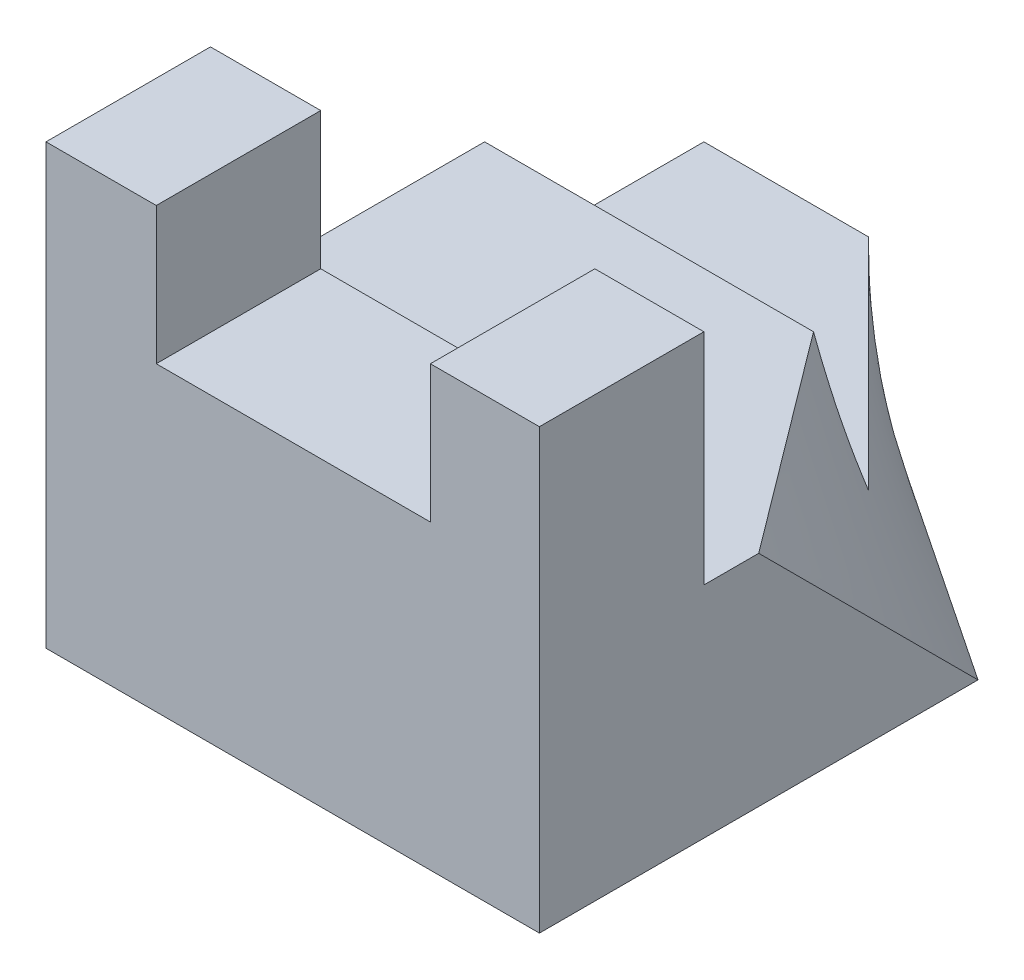
ISO-10303-21;
HEADER;
FILE_DESCRIPTION(('STEP AP214'),'2;1');
FILE_NAME('part.step','',(''),(''),'','','');
FILE_SCHEMA(('AUTOMOTIVE_DESIGN { 1 0 10303 214 1 1 1 1 }'));
ENDSEC;
DATA;
#1=APPLICATION_CONTEXT('core data for automotive mechanical design processes');
#2=APPLICATION_PROTOCOL_DEFINITION('international standard','automotive_design',2000,#1);
#3=PRODUCT_CONTEXT('',#1,'mechanical');
#4=PRODUCT('Part','Part','',(#3));
#5=PRODUCT_RELATED_PRODUCT_CATEGORY('part','',(#4));
#6=PRODUCT_DEFINITION_FORMATION('','',#4);
#7=PRODUCT_DEFINITION_CONTEXT('part definition',#1,'design');
#8=PRODUCT_DEFINITION('design','',#6,#7);
#9=PRODUCT_DEFINITION_SHAPE('','',#8);
#10=(LENGTH_UNIT() NAMED_UNIT(*) SI_UNIT(.MILLI.,.METRE.));
#11=(NAMED_UNIT(*) PLANE_ANGLE_UNIT() SI_UNIT($,.RADIAN.));
#12=(NAMED_UNIT(*) SI_UNIT($,.STERADIAN.) SOLID_ANGLE_UNIT());
#13=UNCERTAINTY_MEASURE_WITH_UNIT(LENGTH_MEASURE(1.E-05),#10,'distance_accuracy_value','');
#14=(GEOMETRIC_REPRESENTATION_CONTEXT(3) GLOBAL_UNCERTAINTY_ASSIGNED_CONTEXT((#13)) GLOBAL_UNIT_ASSIGNED_CONTEXT((#10,
#11,#12)) REPRESENTATION_CONTEXT('',''));
#15=CARTESIAN_POINT('',(0.,0.,0.));
#16=DIRECTION('',(0.,0.,1.));
#17=DIRECTION('',(1.,0.,0.));
#18=AXIS2_PLACEMENT_3D('',#15,#16,#17);
#19=CARTESIAN_POINT('',(-57.15,50.8,19.05));
#20=DIRECTION('',(0.,1.,0.));
#21=DIRECTION('',(0.,0.,1.));
#22=AXIS2_PLACEMENT_3D('',#19,#20,#21);
#23=PLANE('',#22);
#24=DIRECTION('',(0.,0.,-1.));
#25=VECTOR('',#24,1.);
#26=CARTESIAN_POINT('',(-12.6287691119639,50.8,76.2));
#27=LINE('',#26,#25);
#28=CARTESIAN_POINT('',(-12.6287691119639,50.8,38.1));
#29=VERTEX_POINT('',#28);
#30=CARTESIAN_POINT('',(-12.6287691119639,50.8,19.05));
#31=VERTEX_POINT('',#30);
#32=EDGE_CURVE('E279',#29,#31,#27,.T.);
#33=ORIENTED_EDGE('',*,*,#32,.F.);
#34=DIRECTION('',(1.,0.,0.));
#35=VECTOR('',#34,1.);
#36=CARTESIAN_POINT('',(-57.15,50.8,38.1));
#37=LINE('',#36,#35);
#38=CARTESIAN_POINT('',(0.,50.8,38.1));
#39=VERTEX_POINT('',#38);
#40=EDGE_CURVE('E236',#29,#39,#37,.T.);
#41=ORIENTED_EDGE('',*,*,#40,.T.);
#42=DIRECTION('',(0.,0.,1.));
#43=VECTOR('',#42,1.);
#44=CARTESIAN_POINT('',(0.,50.8,19.05));
#45=LINE('',#44,#43);
#46=CARTESIAN_POINT('',(0.,50.8,19.05));
#47=VERTEX_POINT('',#46);
#48=EDGE_CURVE('E230',#47,#39,#45,.T.);
#49=ORIENTED_EDGE('',*,*,#48,.F.);
#50=DIRECTION('',(1.,0.,0.));
#51=VECTOR('',#50,1.);
#52=CARTESIAN_POINT('',(-57.15,50.8,19.05));
#53=LINE('',#52,#51);
#54=EDGE_CURVE('E224',#31,#47,#53,.T.);
#55=ORIENTED_EDGE('',*,*,#54,.F.);
#56=EDGE_LOOP('',(#33,#41,#49,#55));
#57=FACE_BOUND('',#56,.T.);
#58=ADVANCED_FACE('F39',(#57),#23,.T.);
#59=CARTESIAN_POINT('',(-57.15,0.,-38.1));
#60=DIRECTION('',(0.,0.,-1.));
#61=DIRECTION('',(-1.,0.,0.));
#62=AXIS2_PLACEMENT_3D('',#59,#60,#61);
#63=PLANE('',#62);
#64=DIRECTION('',(0.,-1.,0.));
#65=VECTOR('',#64,1.);
#66=CARTESIAN_POINT('',(-38.1,12.7,-38.1));
#67=LINE('',#66,#65);
#68=CARTESIAN_POINT('',(-38.1,12.7,-38.1));
#69=VERTEX_POINT('',#68);
#70=CARTESIAN_POINT('',(-38.1,0.,-38.1));
#71=VERTEX_POINT('',#70);
#72=EDGE_CURVE('E139',#69,#71,#67,.T.);
#73=ORIENTED_EDGE('',*,*,#72,.T.);
#74=DIRECTION('',(1.,0.,0.));
#75=VECTOR('',#74,1.);
#76=CARTESIAN_POINT('',(-57.15,0.,-38.1));
#77=LINE('',#76,#75);
#78=CARTESIAN_POINT('',(-57.15,0.,-38.1));
#79=VERTEX_POINT('',#78);
#80=EDGE_CURVE('E12',#79,#71,#77,.T.);
#81=ORIENTED_EDGE('',*,*,#80,.F.);
#82=DIRECTION('',(0.,1.,0.));
#83=VECTOR('',#82,1.);
#84=CARTESIAN_POINT('',(-57.15,0.,-38.1));
#85=LINE('',#84,#83);
#86=CARTESIAN_POINT('',(-57.15,12.7,-38.1));
#87=VERTEX_POINT('',#86);
#88=EDGE_CURVE('E179',#79,#87,#85,.T.);
#89=ORIENTED_EDGE('',*,*,#88,.T.);
#90=DIRECTION('',(1.,0.,0.));
#91=VECTOR('',#90,1.);
#92=CARTESIAN_POINT('',(-57.15,12.7,-38.1));
#93=LINE('',#92,#91);
#94=EDGE_CURVE('E150',#87,#69,#93,.T.);
#95=ORIENTED_EDGE('',*,*,#94,.T.);
#96=EDGE_LOOP('',(#73,#81,#89,#95));
#97=FACE_BOUND('',#96,.T.);
#98=ADVANCED_FACE('F41',(#97),#63,.T.);
#99=CARTESIAN_POINT('',(-57.15,0.,38.1));
#100=DIRECTION('',(0.,-1.,0.));
#101=DIRECTION('',(0.,0.,-1.));
#102=AXIS2_PLACEMENT_3D('',#99,#100,#101);
#103=PLANE('',#102);
#104=DIRECTION('',(0.832050294337844,0.,0.554700196225229));
#105=VECTOR('',#104,1.);
#106=CARTESIAN_POINT('',(-38.1,0.,-38.1));
#107=LINE('',#106,#105);
#108=CARTESIAN_POINT('',(0.,0.,-12.7));
#109=VERTEX_POINT('',#108);
#110=EDGE_CURVE('E136',#71,#109,#107,.T.);
#111=ORIENTED_EDGE('',*,*,#110,.T.);
#112=DIRECTION('',(0.,0.,-1.));
#113=VECTOR('',#112,1.);
#114=CARTESIAN_POINT('',(0.,0.,38.1));
#115=LINE('',#114,#113);
#116=CARTESIAN_POINT('',(0.,0.,38.1));
#117=VERTEX_POINT('',#116);
#118=EDGE_CURVE('E176',#117,#109,#115,.T.);
#119=ORIENTED_EDGE('',*,*,#118,.F.);
#120=DIRECTION('',(1.,0.,0.));
#121=VECTOR('',#120,1.);
#122=CARTESIAN_POINT('',(-57.15,0.,38.1));
#123=LINE('',#122,#121);
#124=CARTESIAN_POINT('',(-57.15,0.,38.1));
#125=VERTEX_POINT('',#124);
#126=EDGE_CURVE('E48',#125,#117,#123,.T.);
#127=ORIENTED_EDGE('',*,*,#126,.F.);
#128=DIRECTION('',(0.,0.,-1.));
#129=VECTOR('',#128,1.);
#130=CARTESIAN_POINT('',(-57.15,0.,38.1));
#131=LINE('',#130,#129);
#132=EDGE_CURVE('E155',#125,#79,#131,.T.);
#133=ORIENTED_EDGE('',*,*,#132,.T.);
#134=ORIENTED_EDGE('',*,*,#80,.T.);
#135=EDGE_LOOP('',(#111,#119,#127,#133,#134));
#136=FACE_BOUND('',#135,.T.);
#137=ADVANCED_FACE('F153',(#136),#103,.T.);
#138=CARTESIAN_POINT('',(-57.15,50.8,38.1));
#139=DIRECTION('',(0.,0.,1.));
#140=DIRECTION('',(1.,0.,0.));
#141=AXIS2_PLACEMENT_3D('',#138,#139,#140);
#142=PLANE('',#141);
#143=DIRECTION('',(0.,1.,0.));
#144=VECTOR('',#143,1.);
#145=CARTESIAN_POINT('',(-12.6287691119639,50.8,38.1));
#146=LINE('',#145,#144);
#147=CARTESIAN_POINT('',(-12.6287691119639,34.925,38.1));
#148=VERTEX_POINT('',#147);
#149=EDGE_CURVE('E174',#148,#29,#146,.T.);
#150=ORIENTED_EDGE('',*,*,#149,.F.);
#151=DIRECTION('',(1.,0.,0.));
#152=VECTOR('',#151,1.);
#153=CARTESIAN_POINT('',(-57.15,34.925,38.1));
#154=LINE('',#153,#152);
#155=CARTESIAN_POINT('',(-44.3787691119639,34.925,38.1));
#156=VERTEX_POINT('',#155);
#157=EDGE_CURVE('E281',#156,#148,#154,.T.);
#158=ORIENTED_EDGE('',*,*,#157,.F.);
#159=DIRECTION('',(0.,-1.,0.));
#160=VECTOR('',#159,1.);
#161=CARTESIAN_POINT('',(-44.3787691119639,50.8,38.1));
#162=LINE('',#161,#160);
#163=CARTESIAN_POINT('',(-44.3787691119639,50.8,38.1));
#164=VERTEX_POINT('',#163);
#165=EDGE_CURVE('E286',#164,#156,#162,.T.);
#166=ORIENTED_EDGE('',*,*,#165,.F.);
#167=CARTESIAN_POINT('',(-57.15,50.8,38.1));
#168=VERTEX_POINT('',#167);
#169=EDGE_CURVE('E237',#168,#164,#37,.T.);
#170=ORIENTED_EDGE('',*,*,#169,.F.);
#171=DIRECTION('',(0.,-1.,0.));
#172=VECTOR('',#171,1.);
#173=CARTESIAN_POINT('',(-57.15,50.8,38.1));
#174=LINE('',#173,#172);
#175=EDGE_CURVE('E159',#168,#125,#174,.T.);
#176=ORIENTED_EDGE('',*,*,#175,.T.);
#177=ORIENTED_EDGE('',*,*,#126,.T.);
#178=DIRECTION('',(0.,-1.,0.));
#179=VECTOR('',#178,1.);
#180=CARTESIAN_POINT('',(0.,50.8,38.1));
#181=LINE('',#180,#179);
#182=EDGE_CURVE('E180',#39,#117,#181,.T.);
#183=ORIENTED_EDGE('',*,*,#182,.F.);
#184=ORIENTED_EDGE('',*,*,#40,.F.);
#185=EDGE_LOOP('',(#150,#158,#166,#170,#176,#177,#183,#184));
#186=FACE_BOUND('',#185,.T.);
#187=ADVANCED_FACE('F235',(#186),#142,.T.);
#188=DIRECTION('',(0.,0.,-1.));
#189=VECTOR('',#188,1.);
#190=CARTESIAN_POINT('',(-44.3787691119639,50.8,76.2));
#191=LINE('',#190,#189);
#192=CARTESIAN_POINT('',(-44.3787691119639,50.8,19.05));
#193=VERTEX_POINT('',#192);
#194=EDGE_CURVE('E282',#164,#193,#191,.T.);
#195=ORIENTED_EDGE('',*,*,#194,.T.);
#196=CARTESIAN_POINT('',(-57.15,50.8,19.05));
#197=VERTEX_POINT('',#196);
#198=EDGE_CURVE('E242',#197,#193,#53,.T.);
#199=ORIENTED_EDGE('',*,*,#198,.F.);
#200=DIRECTION('',(0.,0.,1.));
#201=VECTOR('',#200,1.);
#202=CARTESIAN_POINT('',(-57.15,50.8,19.05));
#203=LINE('',#202,#201);
#204=EDGE_CURVE('E163',#197,#168,#203,.T.);
#205=ORIENTED_EDGE('',*,*,#204,.T.);
#206=ORIENTED_EDGE('',*,*,#169,.T.);
#207=EDGE_LOOP('',(#195,#199,#205,#206));
#208=FACE_BOUND('',#207,.T.);
#209=ADVANCED_FACE('F265',(#208),#23,.T.);
#210=CARTESIAN_POINT('',(-57.15,25.4,19.05));
#211=DIRECTION('',(0.,0.,-1.));
#212=DIRECTION('',(0.,1.,0.));
#213=AXIS2_PLACEMENT_3D('',#210,#211,#212);
#214=PLANE('',#213);
#215=DIRECTION('',(0.,-1.,0.));
#216=VECTOR('',#215,1.);
#217=CARTESIAN_POINT('',(-12.6287691119639,50.8,19.05));
#218=LINE('',#217,#216);
#219=CARTESIAN_POINT('',(-12.6287691119639,34.925,19.05));
#220=VERTEX_POINT('',#219);
#221=EDGE_CURVE('E65',#31,#220,#218,.T.);
#222=ORIENTED_EDGE('',*,*,#221,.F.);
#223=ORIENTED_EDGE('',*,*,#54,.T.);
#224=DIRECTION('',(0.,1.,0.));
#225=VECTOR('',#224,1.);
#226=CARTESIAN_POINT('',(0.,25.4,19.05));
#227=LINE('',#226,#225);
#228=CARTESIAN_POINT('',(0.,25.4,19.05));
#229=VERTEX_POINT('',#228);
#230=EDGE_CURVE('E169',#229,#47,#227,.T.);
#231=ORIENTED_EDGE('',*,*,#230,.F.);
#232=DIRECTION('',(1.,0.,0.));
#233=VECTOR('',#232,1.);
#234=CARTESIAN_POINT('',(-57.15,25.4,19.05));
#235=LINE('',#234,#233);
#236=CARTESIAN_POINT('',(-57.15,25.4,19.05));
#237=VERTEX_POINT('',#236);
#238=EDGE_CURVE('E217',#237,#229,#235,.T.);
#239=ORIENTED_EDGE('',*,*,#238,.F.);
#240=DIRECTION('',(0.,1.,0.));
#241=VECTOR('',#240,1.);
#242=CARTESIAN_POINT('',(-57.15,25.4,19.05));
#243=LINE('',#242,#241);
#244=EDGE_CURVE('E259',#237,#197,#243,.T.);
#245=ORIENTED_EDGE('',*,*,#244,.T.);
#246=ORIENTED_EDGE('',*,*,#198,.T.);
#247=DIRECTION('',(0.,1.,0.));
#248=VECTOR('',#247,1.);
#249=CARTESIAN_POINT('',(-44.3787691119639,34.925,19.05));
#250=LINE('',#249,#248);
#251=CARTESIAN_POINT('',(-44.3787691119639,34.925,19.05));
#252=VERTEX_POINT('',#251);
#253=EDGE_CURVE('E268',#252,#193,#250,.T.);
#254=ORIENTED_EDGE('',*,*,#253,.F.);
#255=DIRECTION('',(-1.,0.,0.));
#256=VECTOR('',#255,1.);
#257=CARTESIAN_POINT('',(-12.6287691119639,34.925,19.05));
#258=LINE('',#257,#256);
#259=EDGE_CURVE('E270',#220,#252,#258,.T.);
#260=ORIENTED_EDGE('',*,*,#259,.F.);
#261=EDGE_LOOP('',(#222,#223,#231,#239,#245,#246,#254,#260));
#262=FACE_BOUND('',#261,.T.);
#263=ADVANCED_FACE('F226',(#262),#214,.T.);
#264=CARTESIAN_POINT('',(-57.15,25.4,-12.7));
#265=DIRECTION('',(0.,1.,0.));
#266=DIRECTION('',(0.,0.,1.));
#267=AXIS2_PLACEMENT_3D('',#264,#265,#266);
#268=PLANE('',#267);
#269=DIRECTION('',(0.6,0.,0.8));
#270=VECTOR('',#269,1.);
#271=CARTESIAN_POINT('',(-38.1,25.4,-38.1));
#272=LINE('',#271,#270);
#273=CARTESIAN_POINT('',(-19.05,25.4,-12.7));
#274=VERTEX_POINT('',#273);
#275=CARTESIAN_POINT('',(0.,25.4,12.7));
#276=VERTEX_POINT('',#275);
#277=EDGE_CURVE('E56',#274,#276,#272,.T.);
#278=ORIENTED_EDGE('',*,*,#277,.F.);
#279=DIRECTION('',(1.,0.,0.));
#280=VECTOR('',#279,1.);
#281=CARTESIAN_POINT('',(-57.15,25.4,-12.7));
#282=LINE('',#281,#280);
#283=CARTESIAN_POINT('',(-57.15,25.4,-12.7));
#284=VERTEX_POINT('',#283);
#285=EDGE_CURVE('E181',#284,#274,#282,.T.);
#286=ORIENTED_EDGE('',*,*,#285,.F.);
#287=DIRECTION('',(0.,0.,1.));
#288=VECTOR('',#287,1.);
#289=CARTESIAN_POINT('',(-57.15,25.4,-12.7));
#290=LINE('',#289,#288);
#291=EDGE_CURVE('E220',#284,#237,#290,.T.);
#292=ORIENTED_EDGE('',*,*,#291,.T.);
#293=ORIENTED_EDGE('',*,*,#238,.T.);
#294=DIRECTION('',(0.,0.,1.));
#295=VECTOR('',#294,1.);
#296=CARTESIAN_POINT('',(0.,25.4,-12.7));
#297=LINE('',#296,#295);
#298=EDGE_CURVE('E172',#276,#229,#297,.T.);
#299=ORIENTED_EDGE('',*,*,#298,.F.);
#300=EDGE_LOOP('',(#278,#286,#292,#293,#299));
#301=FACE_BOUND('',#300,.T.);
#302=ADVANCED_FACE('F214',(#301),#268,.T.);
#303=CARTESIAN_POINT('',(-57.15,12.7,-12.7));
#304=DIRECTION('',(0.,0.,-1.));
#305=DIRECTION('',(-1.,0.,0.));
#306=AXIS2_PLACEMENT_3D('',#303,#304,#305);
#307=PLANE('',#306);
#308=CARTESIAN_POINT('',(-12.7,12.7,-12.7));
#309=CARTESIAN_POINT('',(-12.9200869699071,13.0301236124747,-12.7));
#310=CARTESIAN_POINT('',(-13.1362026475352,13.3628852299406,-12.7));
#311=CARTESIAN_POINT('',(-13.5601963578838,14.0326383626928,-12.7));
#312=CARTESIAN_POINT('',(-13.7680907411623,14.3696195242032,-12.7));
#313=CARTESIAN_POINT('',(-14.1759527088238,15.0476277676619,-12.7));
#314=CARTESIAN_POINT('',(-14.3759321193666,15.3886477414989,-12.7));
#315=CARTESIAN_POINT('',(-14.7682776556763,16.0745547552151,-12.7));
#316=CARTESIAN_POINT('',(-14.9606516685908,16.4194372861551,-12.7));
#317=CARTESIAN_POINT('',(-15.3380914861579,17.1128940272788,-12.7));
#318=CARTESIAN_POINT('',(-15.5231618213945,17.4614657732054,-12.7));
#319=CARTESIAN_POINT('',(-15.8862926918504,18.1621300533107,-12.7));
#320=CARTESIAN_POINT('',(-16.0643549460186,18.5142216972189,-12.7));
#321=CARTESIAN_POINT('',(-16.4136644009144,19.2215660730518,-12.7));
#322=CARTESIAN_POINT('',(-16.584914693609,19.5768172791393,-12.7));
#323=CARTESIAN_POINT('',(-16.9210016073417,20.2905460790275,-12.7));
#324=CARTESIAN_POINT('',(-17.0858351226643,20.6490251342465,-12.7));
#325=CARTESIAN_POINT('',(-17.40937358414,21.3690871240231,-12.7));
#326=CARTESIAN_POINT('',(-17.5680734300272,21.7306723485543,-12.7));
#327=CARTESIAN_POINT('',(-17.8796178914043,22.456829598029,-12.7));
#328=CARTESIAN_POINT('',(-18.0324558195722,22.8214044901662,-12.7));
#329=CARTESIAN_POINT('',(-18.332538498671,23.5534278872609,-12.7));
#330=CARTESIAN_POINT('',(-18.4797753307482,23.920879635226,-12.7));
#331=CARTESIAN_POINT('',(-18.7689053934225,24.6585527411544,-12.7));
#332=CARTESIAN_POINT('',(-18.9107897777669,25.0287775676925,-12.7));
#333=CARTESIAN_POINT('',(-19.05,25.4,-12.7));
#334=B_SPLINE_CURVE_WITH_KNOTS('',3,(#308,#309,#310,#311,#312,#313,#314,#315,#316,#317,#318,
#319,#320,#321,#322,#323,#324,#325,#326,#327,#328,#329,#330,#331,#332,#333),.UNSPECIFIED.,.F.,
.F.,(4,2,2,2,2,2,2,2,2,2,2,2,4),(0.,1.19024491084424,2.37798956467277,3.56388683812622,
4.7485201705035,5.93240672013124,7.11600105184382,8.29905186962863,9.48266833902054,
10.6672487149168,11.8531425403691,13.040654991591,14.2300510300286),.UNSPECIFIED.);
#335=CARTESIAN_POINT('',(-12.7,12.7,-12.7));
#336=VERTEX_POINT('',#335);
#337=EDGE_CURVE('E253',#336,#274,#334,.T.);
#338=ORIENTED_EDGE('',*,*,#337,.F.);
#339=DIRECTION('',(1.,0.,0.));
#340=VECTOR('',#339,1.);
#341=CARTESIAN_POINT('',(-57.15,12.7,-12.7));
#342=LINE('',#341,#340);
#343=CARTESIAN_POINT('',(-57.15,12.7,-12.7));
#344=VERTEX_POINT('',#343);
#345=EDGE_CURVE('E161',#344,#336,#342,.T.);
#346=ORIENTED_EDGE('',*,*,#345,.F.);
#347=DIRECTION('',(0.,1.,0.));
#348=VECTOR('',#347,1.);
#349=CARTESIAN_POINT('',(-57.15,12.7,-12.7));
#350=LINE('',#349,#348);
#351=EDGE_CURVE('E255',#344,#284,#350,.T.);
#352=ORIENTED_EDGE('',*,*,#351,.T.);
#353=ORIENTED_EDGE('',*,*,#285,.T.);
#354=EDGE_LOOP('',(#338,#346,#352,#353));
#355=FACE_BOUND('',#354,.T.);
#356=ADVANCED_FACE('F252',(#355),#307,.T.);
#357=CARTESIAN_POINT('',(-57.15,12.7,-38.1));
#358=DIRECTION('',(0.,1.,0.));
#359=DIRECTION('',(0.,0.,1.));
#360=AXIS2_PLACEMENT_3D('',#357,#358,#359);
#361=PLANE('',#360);
#362=CARTESIAN_POINT('',(-38.1,12.7,-38.1));
#363=CARTESIAN_POINT('',(-33.8666666666667,12.7,-33.8666666666667));
#364=CARTESIAN_POINT('',(-29.6333333333333,12.7,-29.6333333333333));
#365=CARTESIAN_POINT('',(-21.1666666666667,12.7,-21.1666666666667));
#366=CARTESIAN_POINT('',(-16.9333333333333,12.7,-16.9333333333333));
#367=CARTESIAN_POINT('',(-12.7,12.7,-12.7));
#368=B_SPLINE_CURVE_WITH_KNOTS('',3,(#362,#363,#364,#365,#366,#367),.UNSPECIFIED.,.F.,.F.,(4,2,
4),(0.,17.9605122421383,35.9210244842766),.UNSPECIFIED.);
#369=EDGE_CURVE('E145',#69,#336,#368,.T.);
#370=ORIENTED_EDGE('',*,*,#369,.F.);
#371=ORIENTED_EDGE('',*,*,#94,.F.);
#372=DIRECTION('',(0.,0.,1.));
#373=VECTOR('',#372,1.);
#374=CARTESIAN_POINT('',(-57.15,12.7,-38.1));
#375=LINE('',#374,#373);
#376=EDGE_CURVE('E262',#87,#344,#375,.T.);
#377=ORIENTED_EDGE('',*,*,#376,.T.);
#378=ORIENTED_EDGE('',*,*,#345,.T.);
#379=EDGE_LOOP('',(#370,#371,#377,#378));
#380=FACE_BOUND('',#379,.T.);
#381=ADVANCED_FACE('F289',(#380),#361,.T.);
#382=CARTESIAN_POINT('',(-57.15,0.,0.));
#383=DIRECTION('',(1.,0.,0.));
#384=DIRECTION('',(0.,0.,-1.));
#385=AXIS2_PLACEMENT_3D('',#382,#383,#384);
#386=PLANE('',#385);
#387=ORIENTED_EDGE('',*,*,#88,.F.);
#388=ORIENTED_EDGE('',*,*,#132,.F.);
#389=ORIENTED_EDGE('',*,*,#175,.F.);
#390=ORIENTED_EDGE('',*,*,#204,.F.);
#391=ORIENTED_EDGE('',*,*,#244,.F.);
#392=ORIENTED_EDGE('',*,*,#291,.F.);
#393=ORIENTED_EDGE('',*,*,#351,.F.);
#394=ORIENTED_EDGE('',*,*,#376,.F.);
#395=EDGE_LOOP('',(#387,#388,#389,#390,#391,#392,#393,#394));
#396=FACE_BOUND('',#395,.T.);
#397=ADVANCED_FACE('F256',(#396),#386,.F.);
#398=CARTESIAN_POINT('',(0.,0.,0.));
#399=DIRECTION('',(1.,0.,0.));
#400=DIRECTION('',(0.,0.,-1.));
#401=AXIS2_PLACEMENT_3D('',#398,#399,#400);
#402=PLANE('',#401);
#403=DIRECTION('',(0.,0.707106781186547,0.707106781186547));
#404=VECTOR('',#403,1.);
#405=CARTESIAN_POINT('',(0.,12.7,0.));
#406=LINE('',#405,#404);
#407=EDGE_CURVE('E141',#109,#276,#406,.T.);
#408=ORIENTED_EDGE('',*,*,#407,.T.);
#409=ORIENTED_EDGE('',*,*,#298,.T.);
#410=ORIENTED_EDGE('',*,*,#230,.T.);
#411=ORIENTED_EDGE('',*,*,#48,.T.);
#412=ORIENTED_EDGE('',*,*,#182,.T.);
#413=ORIENTED_EDGE('',*,*,#118,.T.);
#414=EDGE_LOOP('',(#408,#409,#410,#411,#412,#413));
#415=FACE_BOUND('',#414,.T.);
#416=ADVANCED_FACE('F209',(#415),#402,.T.);
#417=CARTESIAN_POINT('',(-12.6287691119639,50.8,76.2));
#418=DIRECTION('',(1.,0.,0.));
#419=DIRECTION('',(0.,1.,0.));
#420=AXIS2_PLACEMENT_3D('',#417,#418,#419);
#421=PLANE('',#420);
#422=ORIENTED_EDGE('',*,*,#149,.T.);
#423=ORIENTED_EDGE('',*,*,#32,.T.);
#424=ORIENTED_EDGE('',*,*,#221,.T.);
#425=DIRECTION('',(0.,0.,-1.));
#426=VECTOR('',#425,1.);
#427=CARTESIAN_POINT('',(-12.6287691119639,34.925,76.2));
#428=LINE('',#427,#426);
#429=EDGE_CURVE('E272',#148,#220,#428,.T.);
#430=ORIENTED_EDGE('',*,*,#429,.F.);
#431=EDGE_LOOP('',(#422,#423,#424,#430));
#432=FACE_BOUND('',#431,.T.);
#433=ADVANCED_FACE('F331',(#432),#421,.F.);
#434=CARTESIAN_POINT('',(-44.3787691119639,34.925,76.2));
#435=DIRECTION('',(-1.,0.,0.));
#436=DIRECTION('',(0.,0.,1.));
#437=AXIS2_PLACEMENT_3D('',#434,#435,#436);
#438=PLANE('',#437);
#439=ORIENTED_EDGE('',*,*,#165,.T.);
#440=DIRECTION('',(0.,0.,-1.));
#441=VECTOR('',#440,1.);
#442=CARTESIAN_POINT('',(-44.3787691119639,34.925,76.2));
#443=LINE('',#442,#441);
#444=EDGE_CURVE('E274',#156,#252,#443,.T.);
#445=ORIENTED_EDGE('',*,*,#444,.T.);
#446=ORIENTED_EDGE('',*,*,#253,.T.);
#447=ORIENTED_EDGE('',*,*,#194,.F.);
#448=EDGE_LOOP('',(#439,#445,#446,#447));
#449=FACE_BOUND('',#448,.T.);
#450=ADVANCED_FACE('F303',(#449),#438,.F.);
#451=CARTESIAN_POINT('',(-12.6287691119639,34.925,76.2));
#452=DIRECTION('',(0.,-1.,0.));
#453=DIRECTION('',(0.,0.,-1.));
#454=AXIS2_PLACEMENT_3D('',#451,#452,#453);
#455=PLANE('',#454);
#456=ORIENTED_EDGE('',*,*,#157,.T.);
#457=ORIENTED_EDGE('',*,*,#429,.T.);
#458=ORIENTED_EDGE('',*,*,#259,.T.);
#459=ORIENTED_EDGE('',*,*,#444,.F.);
#460=EDGE_LOOP('',(#456,#457,#458,#459));
#461=FACE_BOUND('',#460,.T.);
#462=ADVANCED_FACE('F302',(#461),#455,.F.);
#463=CARTESIAN_POINT('',(0.,25.4,12.7));
#464=CARTESIAN_POINT('',(0.,0.,-12.7));
#465=CARTESIAN_POINT('',(-6.34999999999997,25.4,4.23333333333336));
#466=CARTESIAN_POINT('',(-6.34999999999999,0.,-16.9333333333333));
#467=CARTESIAN_POINT('',(-12.7,25.4,-4.2333333333333));
#468=CARTESIAN_POINT('',(-12.7,0.,-21.1666666666667));
#469=CARTESIAN_POINT('',(-25.4,25.4,-21.1666666666666));
#470=CARTESIAN_POINT('',(-25.4,0.,-29.6333333333333));
#471=CARTESIAN_POINT('',(-31.75,25.4,-29.6333333333333));
#472=CARTESIAN_POINT('',(-31.75,0.,-33.8666666666667));
#473=CARTESIAN_POINT('',(-38.1,25.4,-38.1));
#474=CARTESIAN_POINT('',(-38.1,0.,-38.1));
#475=B_SPLINE_SURFACE_WITH_KNOTS('',3,1,((#463,#464),(#465,#466),(#467,#468),(#469,#470),(#471,
#472),(#473,#474)),.UNSPECIFIED.,.F.,.F.,.F.,(4,2,4),(2,2),(0.,0.5,1.),(0.,1.),.UNSPECIFIED.);
#476=ORIENTED_EDGE('',*,*,#337,.T.);
#477=ORIENTED_EDGE('',*,*,#277,.T.);
#478=ORIENTED_EDGE('',*,*,#407,.F.);
#479=ORIENTED_EDGE('',*,*,#110,.F.);
#480=ORIENTED_EDGE('',*,*,#72,.F.);
#481=ORIENTED_EDGE('',*,*,#369,.T.);
#482=EDGE_LOOP('',(#476,#477,#478,#479,#480,#481));
#483=FACE_BOUND('',#482,.T.);
#484=ADVANCED_FACE('F138',(#483),#475,.F.);
#485=CLOSED_SHELL('',(#58,#98,#137,#187,#209,#263,#302,#356,#381,#397,#416,#433,#450,#462,#484));
#486=MANIFOLD_SOLID_BREP('B2',#485);
#487=ADVANCED_BREP_SHAPE_REPRESENTATION('',(#18,#486),#14);
#488=SHAPE_DEFINITION_REPRESENTATION(#9,#487);
ENDSEC;
END-ISO-10303-21;
